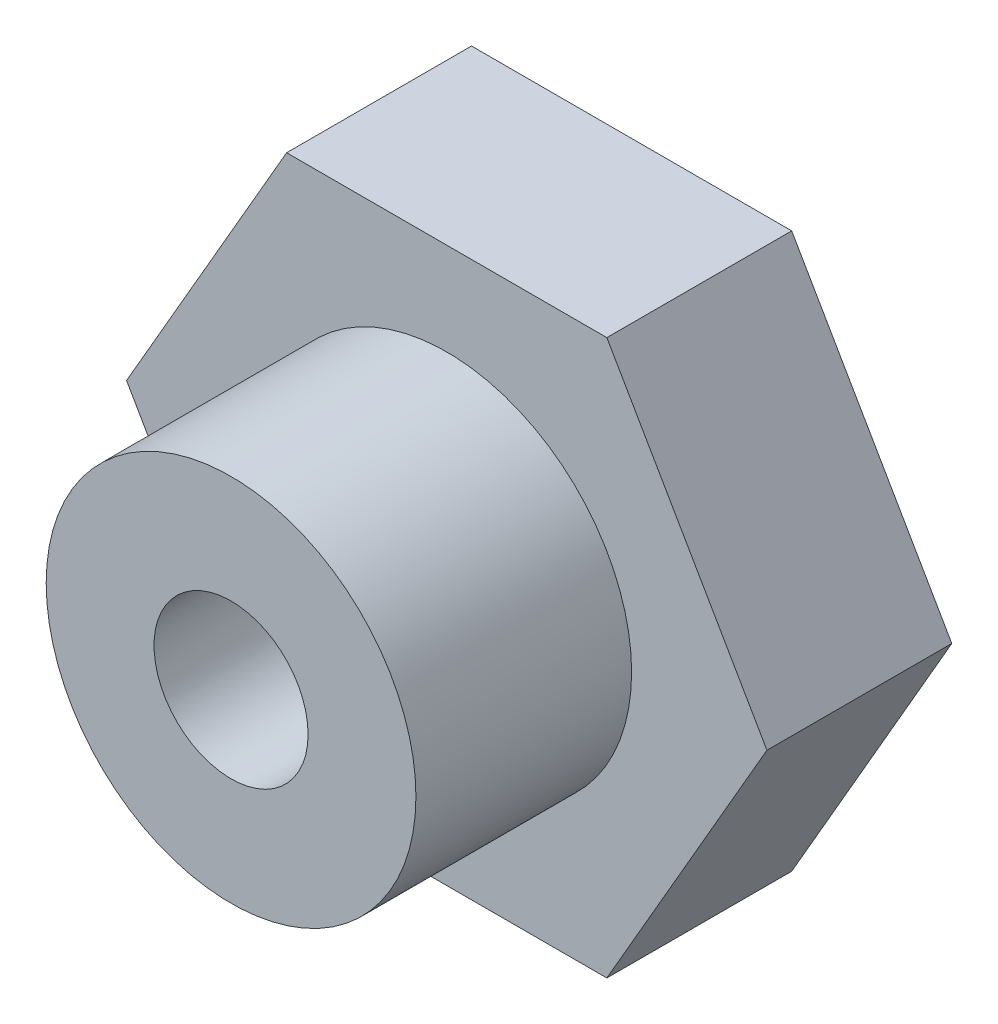
ISO-10303-21;
HEADER;
FILE_DESCRIPTION(('STEP AP214'),'2;1');
FILE_NAME('part.step','',(''),(''),'','','');
FILE_SCHEMA(('AUTOMOTIVE_DESIGN { 1 0 10303 214 1 1 1 1 }'));
ENDSEC;
DATA;
#1=APPLICATION_CONTEXT('core data for automotive mechanical design processes');
#2=APPLICATION_PROTOCOL_DEFINITION('international standard','automotive_design',2000,#1);
#3=PRODUCT_CONTEXT('',#1,'mechanical');
#4=PRODUCT('Part','Part','',(#3));
#5=PRODUCT_RELATED_PRODUCT_CATEGORY('part','',(#4));
#6=PRODUCT_DEFINITION_FORMATION('','',#4);
#7=PRODUCT_DEFINITION_CONTEXT('part definition',#1,'design');
#8=PRODUCT_DEFINITION('design','',#6,#7);
#9=PRODUCT_DEFINITION_SHAPE('','',#8);
#10=(LENGTH_UNIT() NAMED_UNIT(*) SI_UNIT(.MILLI.,.METRE.));
#11=(NAMED_UNIT(*) PLANE_ANGLE_UNIT() SI_UNIT($,.RADIAN.));
#12=(NAMED_UNIT(*) SI_UNIT($,.STERADIAN.) SOLID_ANGLE_UNIT());
#13=UNCERTAINTY_MEASURE_WITH_UNIT(LENGTH_MEASURE(1.E-05),#10,'distance_accuracy_value','');
#14=(GEOMETRIC_REPRESENTATION_CONTEXT(3) GLOBAL_UNCERTAINTY_ASSIGNED_CONTEXT((#13)) GLOBAL_UNIT_ASSIGNED_CONTEXT((#10,
#11,#12)) REPRESENTATION_CONTEXT('',''));
#15=CARTESIAN_POINT('',(0.,0.,0.));
#16=DIRECTION('',(0.,0.,1.));
#17=DIRECTION('',(1.,0.,0.));
#18=AXIS2_PLACEMENT_3D('',#15,#16,#17);
#19=CARTESIAN_POINT('',(0.,-9.,-6.));
#20=DIRECTION('',(0.,-1.,0.));
#21=DIRECTION('',(1.,0.,0.));
#22=AXIS2_PLACEMENT_3D('',#19,#20,#21);
#23=PLANE('',#22);
#24=DIRECTION('',(1.,0.,0.));
#25=VECTOR('',#24,1.);
#26=CARTESIAN_POINT('',(0.,-9.,0.));
#27=LINE('',#26,#25);
#28=CARTESIAN_POINT('',(-5.19615242270655,-9.00000000000006,0.));
#29=VERTEX_POINT('',#28);
#30=CARTESIAN_POINT('',(5.19615242270674,-8.99999999999995,0.));
#31=VERTEX_POINT('',#30);
#32=EDGE_CURVE('E126',#29,#31,#27,.T.);
#33=ORIENTED_EDGE('',*,*,#32,.F.);
#34=DIRECTION('',(0.,0.,1.));
#35=VECTOR('',#34,1.);
#36=CARTESIAN_POINT('',(-5.19615242270655,-9.00000000000006,-6.));
#37=LINE('',#36,#35);
#38=CARTESIAN_POINT('',(-5.19615242270655,-9.00000000000006,-6.));
#39=VERTEX_POINT('',#38);
#40=EDGE_CURVE('E11',#39,#29,#37,.T.);
#41=ORIENTED_EDGE('',*,*,#40,.F.);
#42=DIRECTION('',(1.,0.,0.));
#43=VECTOR('',#42,1.);
#44=CARTESIAN_POINT('',(0.,-9.,-6.));
#45=LINE('',#44,#43);
#46=CARTESIAN_POINT('',(5.19615242270674,-8.99999999999995,-6.));
#47=VERTEX_POINT('',#46);
#48=EDGE_CURVE('E141',#39,#47,#45,.T.);
#49=ORIENTED_EDGE('',*,*,#48,.T.);
#50=DIRECTION('',(0.,0.,1.));
#51=VECTOR('',#50,1.);
#52=CARTESIAN_POINT('',(5.19615242270674,-8.99999999999995,-6.));
#53=LINE('',#52,#51);
#54=EDGE_CURVE('E40',#47,#31,#53,.T.);
#55=ORIENTED_EDGE('',*,*,#54,.T.);
#56=EDGE_LOOP('',(#33,#41,#49,#55));
#57=FACE_BOUND('',#56,.T.);
#58=ADVANCED_FACE('F37',(#57),#23,.T.);
#59=CARTESIAN_POINT('',(-7.79422863405991,-4.50000000000006,-6.));
#60=DIRECTION('',(-0.866025403784435,-0.500000000000007,0.));
#61=DIRECTION('',(0.500000000000007,-0.866025403784434,0.));
#62=AXIS2_PLACEMENT_3D('',#59,#60,#61);
#63=PLANE('',#62);
#64=DIRECTION('',(0.500000000000007,-0.866025403784435,0.));
#65=VECTOR('',#64,1.);
#66=CARTESIAN_POINT('',(-7.79422863405991,-4.50000000000006,0.));
#67=LINE('',#66,#65);
#68=CARTESIAN_POINT('',(-10.3923048454133,0.,0.));
#69=VERTEX_POINT('',#68);
#70=EDGE_CURVE('E139',#69,#29,#67,.T.);
#71=ORIENTED_EDGE('',*,*,#70,.F.);
#72=DIRECTION('',(0.,0.,1.));
#73=VECTOR('',#72,1.);
#74=CARTESIAN_POINT('',(-10.3923048454133,0.,-6.));
#75=LINE('',#74,#73);
#76=CARTESIAN_POINT('',(-10.3923048454133,0.,-6.));
#77=VERTEX_POINT('',#76);
#78=EDGE_CURVE('E46',#77,#69,#75,.T.);
#79=ORIENTED_EDGE('',*,*,#78,.F.);
#80=DIRECTION('',(0.500000000000007,-0.866025403784435,0.));
#81=VECTOR('',#80,1.);
#82=CARTESIAN_POINT('',(-7.79422863405991,-4.50000000000006,-6.));
#83=LINE('',#82,#81);
#84=EDGE_CURVE('E113',#77,#39,#83,.T.);
#85=ORIENTED_EDGE('',*,*,#84,.T.);
#86=ORIENTED_EDGE('',*,*,#40,.T.);
#87=EDGE_LOOP('',(#71,#79,#85,#86));
#88=FACE_BOUND('',#87,.T.);
#89=ADVANCED_FACE('F149',(#88),#63,.T.);
#90=CARTESIAN_POINT('',(-7.79422863405997,4.49999999999995,-6.));
#91=DIRECTION('',(-0.866025403784441,0.499999999999995,0.));
#92=DIRECTION('',(-0.499999999999995,-0.866025403784442,0.));
#93=AXIS2_PLACEMENT_3D('',#90,#91,#92);
#94=PLANE('',#93);
#95=DIRECTION('',(-0.499999999999995,-0.866025403784442,0.));
#96=VECTOR('',#95,1.);
#97=CARTESIAN_POINT('',(-7.79422863405997,4.49999999999995,0.));
#98=LINE('',#97,#96);
#99=CARTESIAN_POINT('',(-5.19615242270668,8.99999999999998,0.));
#100=VERTEX_POINT('',#99);
#101=EDGE_CURVE('E99',#100,#69,#98,.T.);
#102=ORIENTED_EDGE('',*,*,#101,.F.);
#103=DIRECTION('',(0.,0.,1.));
#104=VECTOR('',#103,1.);
#105=CARTESIAN_POINT('',(-5.19615242270668,8.99999999999998,-6.));
#106=LINE('',#105,#104);
#107=CARTESIAN_POINT('',(-5.19615242270668,8.99999999999998,-6.));
#108=VERTEX_POINT('',#107);
#109=EDGE_CURVE('E94',#108,#100,#106,.T.);
#110=ORIENTED_EDGE('',*,*,#109,.F.);
#111=DIRECTION('',(-0.499999999999995,-0.866025403784442,0.));
#112=VECTOR('',#111,1.);
#113=CARTESIAN_POINT('',(-7.79422863405997,4.49999999999995,-6.));
#114=LINE('',#113,#112);
#115=EDGE_CURVE('E97',#108,#77,#114,.T.);
#116=ORIENTED_EDGE('',*,*,#115,.T.);
#117=ORIENTED_EDGE('',*,*,#78,.T.);
#118=EDGE_LOOP('',(#102,#110,#116,#117));
#119=FACE_BOUND('',#118,.T.);
#120=ADVANCED_FACE('F96',(#119),#94,.T.);
#121=CARTESIAN_POINT('',(0.,9.,-6.));
#122=DIRECTION('',(0.,1.,0.));
#123=DIRECTION('',(-1.,0.,0.));
#124=AXIS2_PLACEMENT_3D('',#121,#122,#123);
#125=PLANE('',#124);
#126=DIRECTION('',(-1.,0.,0.));
#127=VECTOR('',#126,1.);
#128=CARTESIAN_POINT('',(0.,9.,0.));
#129=LINE('',#128,#127);
#130=CARTESIAN_POINT('',(5.19615242270662,9.00000000000002,0.));
#131=VERTEX_POINT('',#130);
#132=EDGE_CURVE('E136',#131,#100,#129,.T.);
#133=ORIENTED_EDGE('',*,*,#132,.F.);
#134=DIRECTION('',(0.,0.,1.));
#135=VECTOR('',#134,1.);
#136=CARTESIAN_POINT('',(5.19615242270662,9.00000000000002,-6.));
#137=LINE('',#136,#135);
#138=CARTESIAN_POINT('',(5.19615242270662,9.00000000000002,-6.));
#139=VERTEX_POINT('',#138);
#140=EDGE_CURVE('E104',#139,#131,#137,.T.);
#141=ORIENTED_EDGE('',*,*,#140,.F.);
#142=DIRECTION('',(-1.,0.,0.));
#143=VECTOR('',#142,1.);
#144=CARTESIAN_POINT('',(0.,9.,-6.));
#145=LINE('',#144,#143);
#146=EDGE_CURVE('E111',#139,#108,#145,.T.);
#147=ORIENTED_EDGE('',*,*,#146,.T.);
#148=ORIENTED_EDGE('',*,*,#109,.T.);
#149=EDGE_LOOP('',(#133,#141,#147,#148));
#150=FACE_BOUND('',#149,.T.);
#151=ADVANCED_FACE('F115',(#150),#125,.T.);
#152=CARTESIAN_POINT('',(7.79422863405994,4.50000000000001,-6.));
#153=DIRECTION('',(0.866025403784438,0.500000000000001,0.));
#154=DIRECTION('',(-0.500000000000001,0.866025403784438,0.));
#155=AXIS2_PLACEMENT_3D('',#152,#153,#154);
#156=PLANE('',#155);
#157=DIRECTION('',(-0.500000000000001,0.866025403784438,0.));
#158=VECTOR('',#157,1.);
#159=CARTESIAN_POINT('',(7.79422863405994,4.50000000000001,0.));
#160=LINE('',#159,#158);
#161=CARTESIAN_POINT('',(10.3923048454133,0.,0.));
#162=VERTEX_POINT('',#161);
#163=EDGE_CURVE('E133',#162,#131,#160,.T.);
#164=ORIENTED_EDGE('',*,*,#163,.F.);
#165=DIRECTION('',(0.,0.,1.));
#166=VECTOR('',#165,1.);
#167=CARTESIAN_POINT('',(10.3923048454133,0.,-6.));
#168=LINE('',#167,#166);
#169=CARTESIAN_POINT('',(10.3923048454133,0.,-6.));
#170=VERTEX_POINT('',#169);
#171=EDGE_CURVE('E144',#170,#162,#168,.T.);
#172=ORIENTED_EDGE('',*,*,#171,.F.);
#173=DIRECTION('',(-0.500000000000001,0.866025403784438,0.));
#174=VECTOR('',#173,1.);
#175=CARTESIAN_POINT('',(7.79422863405994,4.50000000000001,-6.));
#176=LINE('',#175,#174);
#177=EDGE_CURVE('E116',#170,#139,#176,.T.);
#178=ORIENTED_EDGE('',*,*,#177,.T.);
#179=ORIENTED_EDGE('',*,*,#140,.T.);
#180=EDGE_LOOP('',(#164,#172,#178,#179));
#181=FACE_BOUND('',#180,.T.);
#182=ADVANCED_FACE('F163',(#181),#156,.T.);
#183=CARTESIAN_POINT('',(7.79422863406,-4.49999999999997,-6.));
#184=DIRECTION('',(0.866025403784441,-0.499999999999995,0.));
#185=DIRECTION('',(0.499999999999995,0.866025403784441,0.));
#186=AXIS2_PLACEMENT_3D('',#183,#184,#185);
#187=PLANE('',#186);
#188=DIRECTION('',(0.499999999999995,0.866025403784442,0.));
#189=VECTOR('',#188,1.);
#190=CARTESIAN_POINT('',(7.79422863406,-4.49999999999997,0.));
#191=LINE('',#190,#189);
#192=EDGE_CURVE('E129',#31,#162,#191,.T.);
#193=ORIENTED_EDGE('',*,*,#192,.F.);
#194=ORIENTED_EDGE('',*,*,#54,.F.);
#195=DIRECTION('',(0.499999999999995,0.866025403784442,0.));
#196=VECTOR('',#195,1.);
#197=CARTESIAN_POINT('',(7.79422863406,-4.49999999999997,-6.));
#198=LINE('',#197,#196);
#199=EDGE_CURVE('E118',#47,#170,#198,.T.);
#200=ORIENTED_EDGE('',*,*,#199,.T.);
#201=ORIENTED_EDGE('',*,*,#171,.T.);
#202=EDGE_LOOP('',(#193,#194,#200,#201));
#203=FACE_BOUND('',#202,.T.);
#204=ADVANCED_FACE('F146',(#203),#187,.T.);
#205=CARTESIAN_POINT('',(0.,0.,-6.));
#206=DIRECTION('',(0.,0.,1.));
#207=DIRECTION('',(1.,0.,0.));
#208=AXIS2_PLACEMENT_3D('',#205,#206,#207);
#209=CYLINDRICAL_SURFACE('',#208,2.5);
#210=CARTESIAN_POINT('',(0.,0.,-6.));
#211=DIRECTION('',(0.,0.,1.));
#212=DIRECTION('',(1.,0.,0.));
#213=AXIS2_PLACEMENT_3D('',#210,#211,#212);
#214=CIRCLE('',#213,2.5);
#215=CARTESIAN_POINT('',(2.5,0.,-6.));
#216=VERTEX_POINT('',#215);
#217=EDGE_CURVE('E123',#216,#216,#214,.T.);
#218=ORIENTED_EDGE('',*,*,#217,.F.);
#219=EDGE_LOOP('',(#218));
#220=FACE_BOUND('',#219,.T.);
#221=CARTESIAN_POINT('',(0.,0.,7.));
#222=DIRECTION('',(0.,0.,1.));
#223=DIRECTION('',(1.,0.,0.));
#224=AXIS2_PLACEMENT_3D('',#221,#222,#223);
#225=CIRCLE('',#224,2.5);
#226=CARTESIAN_POINT('',(2.5,0.,7.));
#227=VERTEX_POINT('',#226);
#228=EDGE_CURVE('E179',#227,#227,#225,.T.);
#229=ORIENTED_EDGE('',*,*,#228,.T.);
#230=EDGE_LOOP('',(#229));
#231=FACE_BOUND('',#230,.T.);
#232=ADVANCED_FACE('F158',(#220,#231),#209,.F.);
#233=CARTESIAN_POINT('',(0.,0.,-6.));
#234=DIRECTION('',(0.,0.,1.));
#235=DIRECTION('',(1.,0.,0.));
#236=AXIS2_PLACEMENT_3D('',#233,#234,#235);
#237=PLANE('',#236);
#238=ORIENTED_EDGE('',*,*,#48,.F.);
#239=ORIENTED_EDGE('',*,*,#84,.F.);
#240=ORIENTED_EDGE('',*,*,#115,.F.);
#241=ORIENTED_EDGE('',*,*,#146,.F.);
#242=ORIENTED_EDGE('',*,*,#177,.F.);
#243=ORIENTED_EDGE('',*,*,#199,.F.);
#244=EDGE_LOOP('',(#238,#239,#240,#241,#242,#243));
#245=FACE_BOUND('',#244,.T.);
#246=ORIENTED_EDGE('',*,*,#217,.T.);
#247=EDGE_LOOP('',(#246));
#248=FACE_BOUND('',#247,.T.);
#249=ADVANCED_FACE('F108',(#245,#248),#237,.F.);
#250=CARTESIAN_POINT('',(0.,0.,0.));
#251=DIRECTION('',(0.,0.,1.));
#252=DIRECTION('',(1.,0.,0.));
#253=AXIS2_PLACEMENT_3D('',#250,#251,#252);
#254=PLANE('',#253);
#255=CARTESIAN_POINT('',(0.,0.,0.));
#256=DIRECTION('',(0.,0.,1.));
#257=DIRECTION('',(1.,0.,0.));
#258=AXIS2_PLACEMENT_3D('',#255,#256,#257);
#259=CIRCLE('',#258,6.);
#260=CARTESIAN_POINT('',(6.,0.,0.));
#261=VERTEX_POINT('',#260);
#262=EDGE_CURVE('E181',#261,#261,#259,.T.);
#263=ORIENTED_EDGE('',*,*,#262,.F.);
#264=EDGE_LOOP('',(#263));
#265=FACE_BOUND('',#264,.T.);
#266=ORIENTED_EDGE('',*,*,#32,.T.);
#267=ORIENTED_EDGE('',*,*,#192,.T.);
#268=ORIENTED_EDGE('',*,*,#163,.T.);
#269=ORIENTED_EDGE('',*,*,#132,.T.);
#270=ORIENTED_EDGE('',*,*,#101,.T.);
#271=ORIENTED_EDGE('',*,*,#70,.T.);
#272=EDGE_LOOP('',(#266,#267,#268,#269,#270,#271));
#273=FACE_BOUND('',#272,.T.);
#274=ADVANCED_FACE('F148',(#265,#273),#254,.T.);
#275=CARTESIAN_POINT('',(0.,0.,7.));
#276=DIRECTION('',(0.,0.,-1.));
#277=DIRECTION('',(-1.,0.,0.));
#278=AXIS2_PLACEMENT_3D('',#275,#276,#277);
#279=CYLINDRICAL_SURFACE('',#278,6.);
#280=CARTESIAN_POINT('',(0.,0.,7.));
#281=DIRECTION('',(0.,0.,1.));
#282=DIRECTION('',(1.,0.,0.));
#283=AXIS2_PLACEMENT_3D('',#280,#281,#282);
#284=CIRCLE('',#283,6.);
#285=CARTESIAN_POINT('',(6.,0.,7.));
#286=VERTEX_POINT('',#285);
#287=EDGE_CURVE('E130',#286,#286,#284,.T.);
#288=ORIENTED_EDGE('',*,*,#287,.F.);
#289=EDGE_LOOP('',(#288));
#290=FACE_BOUND('',#289,.T.);
#291=ORIENTED_EDGE('',*,*,#262,.T.);
#292=EDGE_LOOP('',(#291));
#293=FACE_BOUND('',#292,.T.);
#294=ADVANCED_FACE('F190',(#290,#293),#279,.T.);
#295=CARTESIAN_POINT('',(0.,0.,7.));
#296=DIRECTION('',(0.,0.,1.));
#297=DIRECTION('',(1.,0.,0.));
#298=AXIS2_PLACEMENT_3D('',#295,#296,#297);
#299=PLANE('',#298);
#300=ORIENTED_EDGE('',*,*,#228,.F.);
#301=EDGE_LOOP('',(#300));
#302=FACE_BOUND('',#301,.T.);
#303=ORIENTED_EDGE('',*,*,#287,.T.);
#304=EDGE_LOOP('',(#303));
#305=FACE_BOUND('',#304,.T.);
#306=ADVANCED_FACE('F196',(#302,#305),#299,.T.);
#307=CLOSED_SHELL('',(#58,#89,#120,#151,#182,#204,#232,#249,#274,#294,#306));
#308=MANIFOLD_SOLID_BREP('B2',#307);
#309=ADVANCED_BREP_SHAPE_REPRESENTATION('',(#18,#308),#14);
#310=SHAPE_DEFINITION_REPRESENTATION(#9,#309);
ENDSEC;
END-ISO-10303-21;
